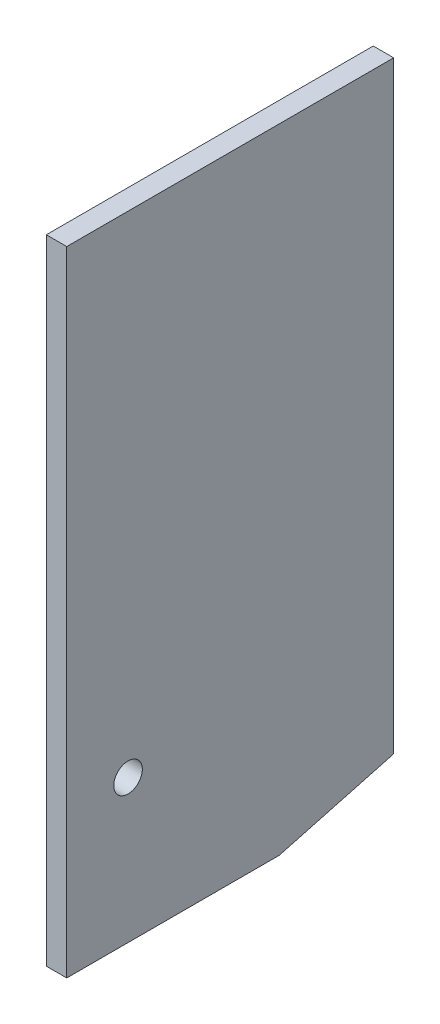
ISO-10303-21;
HEADER;
FILE_DESCRIPTION(('STEP AP214'),'2;1');
FILE_NAME('part.step','',(''),(''),'','','');
FILE_SCHEMA(('AUTOMOTIVE_DESIGN { 1 0 10303 214 1 1 1 1 }'));
ENDSEC;
DATA;
#1=APPLICATION_CONTEXT('core data for automotive mechanical design processes');
#2=APPLICATION_PROTOCOL_DEFINITION('international standard','automotive_design',2000,#1);
#3=PRODUCT_CONTEXT('',#1,'mechanical');
#4=PRODUCT('Part','Part','',(#3));
#5=PRODUCT_RELATED_PRODUCT_CATEGORY('part','',(#4));
#6=PRODUCT_DEFINITION_FORMATION('','',#4);
#7=PRODUCT_DEFINITION_CONTEXT('part definition',#1,'design');
#8=PRODUCT_DEFINITION('design','',#6,#7);
#9=PRODUCT_DEFINITION_SHAPE('','',#8);
#10=(LENGTH_UNIT() NAMED_UNIT(*) SI_UNIT(.MILLI.,.METRE.));
#11=(NAMED_UNIT(*) PLANE_ANGLE_UNIT() SI_UNIT($,.RADIAN.));
#12=(NAMED_UNIT(*) SI_UNIT($,.STERADIAN.) SOLID_ANGLE_UNIT());
#13=UNCERTAINTY_MEASURE_WITH_UNIT(LENGTH_MEASURE(1.E-05),#10,'distance_accuracy_value','');
#14=(GEOMETRIC_REPRESENTATION_CONTEXT(3) GLOBAL_UNCERTAINTY_ASSIGNED_CONTEXT((#13)) GLOBAL_UNIT_ASSIGNED_CONTEXT((#10,
#11,#12)) REPRESENTATION_CONTEXT('',''));
#15=CARTESIAN_POINT('',(0.,0.,0.));
#16=DIRECTION('',(0.,0.,1.));
#17=DIRECTION('',(1.,0.,0.));
#18=AXIS2_PLACEMENT_3D('',#15,#16,#17);
#19=CARTESIAN_POINT('',(-0.01,-155.,0.0100000000000466));
#20=DIRECTION('',(0.,-1.,0.));
#21=DIRECTION('',(0.,0.,-1.));
#22=AXIS2_PLACEMENT_3D('',#19,#20,#21);
#23=PLANE('',#22);
#24=DIRECTION('',(0.,0.,-1.));
#25=VECTOR('',#24,1.);
#26=CARTESIAN_POINT('',(5.,-155.,-40.));
#27=LINE('',#26,#25);
#28=CARTESIAN_POINT('',(5.,-155.,0.));
#29=VERTEX_POINT('',#28);
#30=CARTESIAN_POINT('',(5.,-155.,-52.0096189432339));
#31=VERTEX_POINT('',#30);
#32=EDGE_CURVE('E59',#29,#31,#27,.T.);
#33=ORIENTED_EDGE('',*,*,#32,.F.);
#34=DIRECTION('',(1.,0.,0.));
#35=VECTOR('',#34,1.);
#36=CARTESIAN_POINT('',(2.5,-155.,0.));
#37=LINE('',#36,#35);
#38=CARTESIAN_POINT('',(0.,-155.,0.));
#39=VERTEX_POINT('',#38);
#40=EDGE_CURVE('E61',#39,#29,#37,.T.);
#41=ORIENTED_EDGE('',*,*,#40,.F.);
#42=DIRECTION('',(0.,0.,1.));
#43=VECTOR('',#42,1.);
#44=CARTESIAN_POINT('',(0.,-155.,-40.));
#45=LINE('',#44,#43);
#46=CARTESIAN_POINT('',(0.,-155.,-52.0096189432339));
#47=VERTEX_POINT('',#46);
#48=EDGE_CURVE('E82',#47,#39,#45,.T.);
#49=ORIENTED_EDGE('',*,*,#48,.F.);
#50=DIRECTION('',(-1.,0.,0.));
#51=VECTOR('',#50,1.);
#52=CARTESIAN_POINT('',(2.5,-155.,-52.0096189432339));
#53=LINE('',#52,#51);
#54=EDGE_CURVE('E54',#31,#47,#53,.T.);
#55=ORIENTED_EDGE('',*,*,#54,.F.);
#56=EDGE_LOOP('',(#33,#41,#49,#55));
#57=FACE_BOUND('',#56,.T.);
#58=ADVANCED_FACE('F17',(#57),#23,.T.);
#59=CARTESIAN_POINT('',(-0.01,0.01,0.));
#60=DIRECTION('',(0.,0.,1.));
#61=DIRECTION('',(0.,-1.,0.));
#62=AXIS2_PLACEMENT_3D('',#59,#60,#61);
#63=PLANE('',#62);
#64=DIRECTION('',(0.,-1.,0.));
#65=VECTOR('',#64,1.);
#66=CARTESIAN_POINT('',(5.,-77.5,0.));
#67=LINE('',#66,#65);
#68=CARTESIAN_POINT('',(5.,0.,0.));
#69=VERTEX_POINT('',#68);
#70=EDGE_CURVE('E71',#69,#29,#67,.T.);
#71=ORIENTED_EDGE('',*,*,#70,.F.);
#72=DIRECTION('',(1.,0.,0.));
#73=VECTOR('',#72,1.);
#74=CARTESIAN_POINT('',(2.5,0.,0.));
#75=LINE('',#74,#73);
#76=CARTESIAN_POINT('',(0.,0.,0.));
#77=VERTEX_POINT('',#76);
#78=EDGE_CURVE('E76',#77,#69,#75,.T.);
#79=ORIENTED_EDGE('',*,*,#78,.F.);
#80=DIRECTION('',(0.,1.,0.));
#81=VECTOR('',#80,1.);
#82=CARTESIAN_POINT('',(0.,-77.5,0.));
#83=LINE('',#82,#81);
#84=EDGE_CURVE('E74',#39,#77,#83,.T.);
#85=ORIENTED_EDGE('',*,*,#84,.F.);
#86=ORIENTED_EDGE('',*,*,#40,.T.);
#87=EDGE_LOOP('',(#71,#79,#85,#86));
#88=FACE_BOUND('',#87,.T.);
#89=ADVANCED_FACE('F69',(#88),#63,.T.);
#90=CARTESIAN_POINT('',(-0.01,0.,-80.01));
#91=DIRECTION('',(0.,1.,0.));
#92=DIRECTION('',(0.,0.,1.));
#93=AXIS2_PLACEMENT_3D('',#90,#91,#92);
#94=PLANE('',#93);
#95=DIRECTION('',(0.,0.,1.));
#96=VECTOR('',#95,1.);
#97=CARTESIAN_POINT('',(5.,0.,-40.));
#98=LINE('',#97,#96);
#99=CARTESIAN_POINT('',(5.,0.,-80.));
#100=VERTEX_POINT('',#99);
#101=EDGE_CURVE('E81',#100,#69,#98,.T.);
#102=ORIENTED_EDGE('',*,*,#101,.F.);
#103=DIRECTION('',(1.,0.,0.));
#104=VECTOR('',#103,1.);
#105=CARTESIAN_POINT('',(2.5,0.,-80.));
#106=LINE('',#105,#104);
#107=CARTESIAN_POINT('',(0.,0.,-80.));
#108=VERTEX_POINT('',#107);
#109=EDGE_CURVE('E90',#108,#100,#106,.T.);
#110=ORIENTED_EDGE('',*,*,#109,.F.);
#111=DIRECTION('',(0.,0.,-1.));
#112=VECTOR('',#111,1.);
#113=CARTESIAN_POINT('',(0.,0.,-40.));
#114=LINE('',#113,#112);
#115=EDGE_CURVE('E101',#77,#108,#114,.T.);
#116=ORIENTED_EDGE('',*,*,#115,.F.);
#117=ORIENTED_EDGE('',*,*,#78,.T.);
#118=EDGE_LOOP('',(#102,#110,#116,#117));
#119=FACE_BOUND('',#118,.T.);
#120=ADVANCED_FACE('F113',(#119),#94,.T.);
#121=CARTESIAN_POINT('',(-0.01,-147.51,-80.));
#122=DIRECTION('',(0.,0.,-1.));
#123=DIRECTION('',(0.,1.,0.));
#124=AXIS2_PLACEMENT_3D('',#121,#122,#123);
#125=PLANE('',#124);
#126=DIRECTION('',(0.,1.,0.));
#127=VECTOR('',#126,1.);
#128=CARTESIAN_POINT('',(5.,-77.5,-80.));
#129=LINE('',#128,#127);
#130=CARTESIAN_POINT('',(5.,-147.5,-80.));
#131=VERTEX_POINT('',#130);
#132=EDGE_CURVE('E85',#131,#100,#129,.T.);
#133=ORIENTED_EDGE('',*,*,#132,.F.);
#134=DIRECTION('',(1.,0.,0.));
#135=VECTOR('',#134,1.);
#136=CARTESIAN_POINT('',(2.5,-147.5,-80.));
#137=LINE('',#136,#135);
#138=CARTESIAN_POINT('',(0.,-147.5,-80.));
#139=VERTEX_POINT('',#138);
#140=EDGE_CURVE('E36',#139,#131,#137,.T.);
#141=ORIENTED_EDGE('',*,*,#140,.F.);
#142=DIRECTION('',(0.,-1.,0.));
#143=VECTOR('',#142,1.);
#144=CARTESIAN_POINT('',(0.,-77.5,-80.));
#145=LINE('',#144,#143);
#146=EDGE_CURVE('E98',#108,#139,#145,.T.);
#147=ORIENTED_EDGE('',*,*,#146,.F.);
#148=ORIENTED_EDGE('',*,*,#109,.T.);
#149=EDGE_LOOP('',(#133,#141,#147,#148));
#150=FACE_BOUND('',#149,.T.);
#151=ADVANCED_FACE('F110',(#150),#125,.T.);
#152=CARTESIAN_POINT('',(-0.01,-155.002588190451,-51.999959684971));
#153=DIRECTION('',(0.,-0.965925826289068,-0.258819045102521));
#154=DIRECTION('',(0.,0.258819045102521,-0.965925826289068));
#155=AXIS2_PLACEMENT_3D('',#152,#153,#154);
#156=PLANE('',#155);
#157=DIRECTION('',(0.,0.258819045102525,-0.965925826289067));
#158=VECTOR('',#157,1.);
#159=CARTESIAN_POINT('',(5.,-155.,-52.0096189432339));
#160=LINE('',#159,#158);
#161=EDGE_CURVE('E21',#31,#131,#160,.T.);
#162=ORIENTED_EDGE('',*,*,#161,.F.);
#163=ORIENTED_EDGE('',*,*,#54,.T.);
#164=DIRECTION('',(0.,-0.258819045102525,0.965925826289067));
#165=VECTOR('',#164,1.);
#166=CARTESIAN_POINT('',(0.,-147.5,-80.));
#167=LINE('',#166,#165);
#168=EDGE_CURVE('E100',#139,#47,#167,.T.);
#169=ORIENTED_EDGE('',*,*,#168,.F.);
#170=ORIENTED_EDGE('',*,*,#140,.T.);
#171=EDGE_LOOP('',(#162,#163,#169,#170));
#172=FACE_BOUND('',#171,.T.);
#173=ADVANCED_FACE('F109',(#172),#156,.T.);
#174=CARTESIAN_POINT('',(5.,-155.01,0.0100000000000522));
#175=DIRECTION('',(1.,0.,0.));
#176=DIRECTION('',(0.,0.,-1.));
#177=AXIS2_PLACEMENT_3D('',#174,#175,#176);
#178=PLANE('',#177);
#179=CARTESIAN_POINT('',(5.,-120.,-15.));
#180=DIRECTION('',(1.,0.,0.));
#181=DIRECTION('',(0.,0.,-1.));
#182=AXIS2_PLACEMENT_3D('',#179,#180,#181);
#183=CIRCLE('',#182,3.5);
#184=CARTESIAN_POINT('',(5.,-120.,-18.5));
#185=VERTEX_POINT('',#184);
#186=EDGE_CURVE('E27',#185,#185,#183,.T.);
#187=ORIENTED_EDGE('',*,*,#186,.F.);
#188=EDGE_LOOP('',(#187));
#189=FACE_BOUND('',#188,.T.);
#190=ORIENTED_EDGE('',*,*,#101,.T.);
#191=ORIENTED_EDGE('',*,*,#70,.T.);
#192=ORIENTED_EDGE('',*,*,#32,.T.);
#193=ORIENTED_EDGE('',*,*,#161,.T.);
#194=ORIENTED_EDGE('',*,*,#132,.T.);
#195=EDGE_LOOP('',(#190,#191,#192,#193,#194));
#196=FACE_BOUND('',#195,.T.);
#197=ADVANCED_FACE('F78',(#189,#196),#178,.T.);
#198=CARTESIAN_POINT('',(0.,-155.01,-80.01));
#199=DIRECTION('',(-1.,0.,0.));
#200=DIRECTION('',(0.,0.,1.));
#201=AXIS2_PLACEMENT_3D('',#198,#199,#200);
#202=PLANE('',#201);
#203=CARTESIAN_POINT('',(0.,-120.,-15.));
#204=DIRECTION('',(1.,0.,0.));
#205=DIRECTION('',(0.,0.,-1.));
#206=AXIS2_PLACEMENT_3D('',#203,#204,#205);
#207=CIRCLE('',#206,3.5);
#208=CARTESIAN_POINT('',(0.,-120.,-18.5));
#209=VERTEX_POINT('',#208);
#210=EDGE_CURVE('E11',#209,#209,#207,.F.);
#211=ORIENTED_EDGE('',*,*,#210,.F.);
#212=EDGE_LOOP('',(#211));
#213=FACE_BOUND('',#212,.T.);
#214=ORIENTED_EDGE('',*,*,#146,.T.);
#215=ORIENTED_EDGE('',*,*,#168,.T.);
#216=ORIENTED_EDGE('',*,*,#48,.T.);
#217=ORIENTED_EDGE('',*,*,#84,.T.);
#218=ORIENTED_EDGE('',*,*,#115,.T.);
#219=EDGE_LOOP('',(#214,#215,#216,#217,#218));
#220=FACE_BOUND('',#219,.T.);
#221=ADVANCED_FACE('F106',(#213,#220),#202,.T.);
#222=CARTESIAN_POINT('',(0.,-120.,-15.));
#223=DIRECTION('',(1.,0.,0.));
#224=DIRECTION('',(0.,0.,-1.));
#225=AXIS2_PLACEMENT_3D('',#222,#223,#224);
#226=CYLINDRICAL_SURFACE('',#225,3.5);
#227=ORIENTED_EDGE('',*,*,#210,.T.);
#228=EDGE_LOOP('',(#227));
#229=FACE_BOUND('',#228,.T.);
#230=ORIENTED_EDGE('',*,*,#186,.T.);
#231=EDGE_LOOP('',(#230));
#232=FACE_BOUND('',#231,.T.);
#233=ADVANCED_FACE('F19',(#229,#232),#226,.F.);
#234=CLOSED_SHELL('',(#58,#89,#120,#151,#173,#197,#221,#233));
#235=MANIFOLD_SOLID_BREP('B1',#234);
#236=ADVANCED_BREP_SHAPE_REPRESENTATION('',(#18,#235),#14);
#237=SHAPE_DEFINITION_REPRESENTATION(#9,#236);
ENDSEC;
END-ISO-10303-21;
